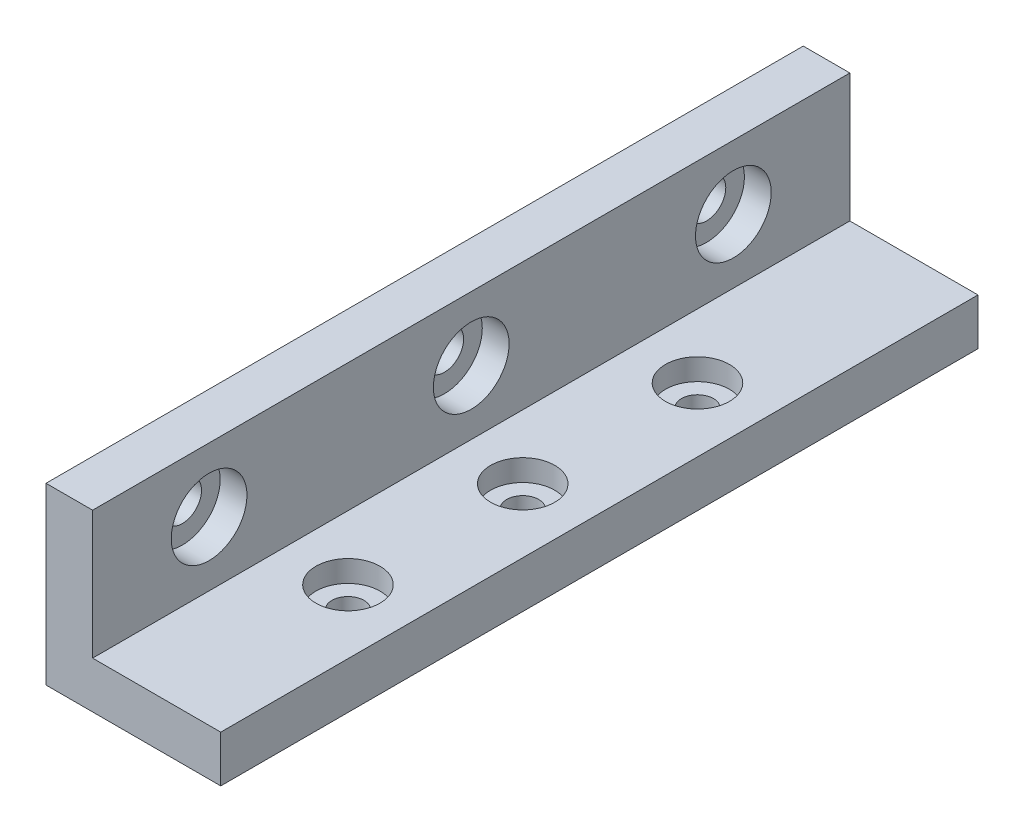
ISO-10303-21;
HEADER;
FILE_DESCRIPTION(('STEP AP214'),'2;1');
FILE_NAME('part.step','',(''),(''),'','','');
FILE_SCHEMA(('AUTOMOTIVE_DESIGN { 1 0 10303 214 1 1 1 1 }'));
ENDSEC;
DATA;
#1=APPLICATION_CONTEXT('core data for automotive mechanical design processes');
#2=APPLICATION_PROTOCOL_DEFINITION('international standard','automotive_design',2000,#1);
#3=PRODUCT_CONTEXT('',#1,'mechanical');
#4=PRODUCT('Part','Part','',(#3));
#5=PRODUCT_RELATED_PRODUCT_CATEGORY('part','',(#4));
#6=PRODUCT_DEFINITION_FORMATION('','',#4);
#7=PRODUCT_DEFINITION_CONTEXT('part definition',#1,'design');
#8=PRODUCT_DEFINITION('design','',#6,#7);
#9=PRODUCT_DEFINITION_SHAPE('','',#8);
#10=(LENGTH_UNIT() NAMED_UNIT(*) SI_UNIT(.MILLI.,.METRE.));
#11=(NAMED_UNIT(*) PLANE_ANGLE_UNIT() SI_UNIT($,.RADIAN.));
#12=(NAMED_UNIT(*) SI_UNIT($,.STERADIAN.) SOLID_ANGLE_UNIT());
#13=UNCERTAINTY_MEASURE_WITH_UNIT(LENGTH_MEASURE(1.E-05),#10,'distance_accuracy_value','');
#14=(GEOMETRIC_REPRESENTATION_CONTEXT(3) GLOBAL_UNCERTAINTY_ASSIGNED_CONTEXT((#13)) GLOBAL_UNIT_ASSIGNED_CONTEXT((#10,
#11,#12)) REPRESENTATION_CONTEXT('',''));
#15=CARTESIAN_POINT('',(0.,0.,0.));
#16=DIRECTION('',(0.,0.,1.));
#17=DIRECTION('',(1.,0.,0.));
#18=AXIS2_PLACEMENT_3D('',#15,#16,#17);
#19=CARTESIAN_POINT('',(0.,0.,130.));
#20=DIRECTION('',(0.,1.,0.));
#21=DIRECTION('',(0.,0.,1.));
#22=AXIS2_PLACEMENT_3D('',#19,#20,#21);
#23=PLANE('',#22);
#24=CARTESIAN_POINT('',(19.,0.,67.1605336776415));
#25=DIRECTION('',(0.,1.,0.));
#26=DIRECTION('',(0.,0.,1.));
#27=AXIS2_PLACEMENT_3D('',#24,#25,#26);
#28=CIRCLE('',#27,2.75);
#29=CARTESIAN_POINT('',(19.,0.,69.9105336776415));
#30=VERTEX_POINT('',#29);
#31=EDGE_CURVE('E182',#30,#30,#28,.T.);
#32=ORIENTED_EDGE('',*,*,#31,.T.);
#33=EDGE_LOOP('',(#32));
#34=FACE_BOUND('',#33,.T.);
#35=CARTESIAN_POINT('',(19.,0.,37.1605336776415));
#36=DIRECTION('',(0.,1.,0.));
#37=DIRECTION('',(0.,0.,1.));
#38=AXIS2_PLACEMENT_3D('',#35,#36,#37);
#39=CIRCLE('',#38,2.75);
#40=CARTESIAN_POINT('',(19.,0.,39.9105336776415));
#41=VERTEX_POINT('',#40);
#42=EDGE_CURVE('E186',#41,#41,#39,.T.);
#43=ORIENTED_EDGE('',*,*,#42,.T.);
#44=EDGE_LOOP('',(#43));
#45=FACE_BOUND('',#44,.T.);
#46=CARTESIAN_POINT('',(19.,0.,97.1605336776415));
#47=DIRECTION('',(0.,1.,0.));
#48=DIRECTION('',(0.,0.,1.));
#49=AXIS2_PLACEMENT_3D('',#46,#47,#48);
#50=CIRCLE('',#49,2.75);
#51=CARTESIAN_POINT('',(19.,0.,99.9105336776415));
#52=VERTEX_POINT('',#51);
#53=EDGE_CURVE('E135',#52,#52,#50,.T.);
#54=ORIENTED_EDGE('',*,*,#53,.T.);
#55=EDGE_LOOP('',(#54));
#56=FACE_BOUND('',#55,.T.);
#57=DIRECTION('',(1.,0.,0.));
#58=VECTOR('',#57,1.);
#59=CARTESIAN_POINT('',(0.,0.,0.));
#60=LINE('',#59,#58);
#61=CARTESIAN_POINT('',(0.,0.,0.));
#62=VERTEX_POINT('',#61);
#63=CARTESIAN_POINT('',(30.,0.,0.));
#64=VERTEX_POINT('',#63);
#65=EDGE_CURVE('E132',#62,#64,#60,.T.);
#66=ORIENTED_EDGE('',*,*,#65,.T.);
#67=DIRECTION('',(0.,0.,-1.));
#68=VECTOR('',#67,1.);
#69=CARTESIAN_POINT('',(30.,0.,130.));
#70=LINE('',#69,#68);
#71=CARTESIAN_POINT('',(30.,0.,130.));
#72=VERTEX_POINT('',#71);
#73=EDGE_CURVE('E13',#72,#64,#70,.T.);
#74=ORIENTED_EDGE('',*,*,#73,.F.);
#75=DIRECTION('',(1.,0.,0.));
#76=VECTOR('',#75,1.);
#77=CARTESIAN_POINT('',(0.,0.,130.));
#78=LINE('',#77,#76);
#79=CARTESIAN_POINT('',(0.,0.,130.));
#80=VERTEX_POINT('',#79);
#81=EDGE_CURVE('E147',#80,#72,#78,.T.);
#82=ORIENTED_EDGE('',*,*,#81,.F.);
#83=DIRECTION('',(0.,0.,-1.));
#84=VECTOR('',#83,1.);
#85=CARTESIAN_POINT('',(0.,0.,130.));
#86=LINE('',#85,#84);
#87=EDGE_CURVE('E64',#80,#62,#86,.T.);
#88=ORIENTED_EDGE('',*,*,#87,.T.);
#89=EDGE_LOOP('',(#66,#74,#82,#88));
#90=FACE_BOUND('',#89,.T.);
#91=ADVANCED_FACE('F48',(#34,#45,#56,#90),#23,.F.);
#92=CARTESIAN_POINT('',(30.,0.,130.));
#93=DIRECTION('',(-1.,0.,0.));
#94=DIRECTION('',(0.,0.,1.));
#95=AXIS2_PLACEMENT_3D('',#92,#93,#94);
#96=PLANE('',#95);
#97=DIRECTION('',(0.,1.,0.));
#98=VECTOR('',#97,1.);
#99=CARTESIAN_POINT('',(30.,0.,0.));
#100=LINE('',#99,#98);
#101=CARTESIAN_POINT('',(30.,8.,0.));
#102=VERTEX_POINT('',#101);
#103=EDGE_CURVE('E134',#64,#102,#100,.T.);
#104=ORIENTED_EDGE('',*,*,#103,.T.);
#105=DIRECTION('',(0.,0.,-1.));
#106=VECTOR('',#105,1.);
#107=CARTESIAN_POINT('',(30.,8.,130.));
#108=LINE('',#107,#106);
#109=CARTESIAN_POINT('',(30.,8.,130.));
#110=VERTEX_POINT('',#109);
#111=EDGE_CURVE('E56',#110,#102,#108,.T.);
#112=ORIENTED_EDGE('',*,*,#111,.F.);
#113=DIRECTION('',(0.,1.,0.));
#114=VECTOR('',#113,1.);
#115=CARTESIAN_POINT('',(30.,0.,130.));
#116=LINE('',#115,#114);
#117=EDGE_CURVE('E96',#72,#110,#116,.T.);
#118=ORIENTED_EDGE('',*,*,#117,.F.);
#119=ORIENTED_EDGE('',*,*,#73,.T.);
#120=EDGE_LOOP('',(#104,#112,#118,#119));
#121=FACE_BOUND('',#120,.T.);
#122=ADVANCED_FACE('F153',(#121),#96,.F.);
#123=CARTESIAN_POINT('',(0.,8.,130.));
#124=DIRECTION('',(0.,1.,0.));
#125=DIRECTION('',(0.,0.,1.));
#126=AXIS2_PLACEMENT_3D('',#123,#124,#125);
#127=PLANE('',#126);
#128=CARTESIAN_POINT('',(19.,8.,67.1605336776415));
#129=DIRECTION('',(0.,1.,0.));
#130=DIRECTION('',(0.,0.,1.));
#131=AXIS2_PLACEMENT_3D('',#128,#129,#130);
#132=CIRCLE('',#131,5.5);
#133=CARTESIAN_POINT('',(19.,8.,72.6605336776415));
#134=VERTEX_POINT('',#133);
#135=EDGE_CURVE('E219',#134,#134,#132,.T.);
#136=ORIENTED_EDGE('',*,*,#135,.F.);
#137=EDGE_LOOP('',(#136));
#138=FACE_BOUND('',#137,.T.);
#139=CARTESIAN_POINT('',(19.,8.,37.1605336776415));
#140=DIRECTION('',(0.,1.,0.));
#141=DIRECTION('',(0.,0.,1.));
#142=AXIS2_PLACEMENT_3D('',#139,#140,#141);
#143=CIRCLE('',#142,5.5);
#144=CARTESIAN_POINT('',(19.,8.,42.6605336776415));
#145=VERTEX_POINT('',#144);
#146=EDGE_CURVE('E209',#145,#145,#143,.T.);
#147=ORIENTED_EDGE('',*,*,#146,.F.);
#148=EDGE_LOOP('',(#147));
#149=FACE_BOUND('',#148,.T.);
#150=CARTESIAN_POINT('',(19.,8.,97.1605336776415));
#151=DIRECTION('',(0.,1.,0.));
#152=DIRECTION('',(0.,0.,1.));
#153=AXIS2_PLACEMENT_3D('',#150,#151,#152);
#154=CIRCLE('',#153,5.5);
#155=CARTESIAN_POINT('',(19.,8.,102.660533677641));
#156=VERTEX_POINT('',#155);
#157=EDGE_CURVE('E199',#156,#156,#154,.T.);
#158=ORIENTED_EDGE('',*,*,#157,.F.);
#159=EDGE_LOOP('',(#158));
#160=FACE_BOUND('',#159,.T.);
#161=DIRECTION('',(1.,0.,0.));
#162=VECTOR('',#161,1.);
#163=CARTESIAN_POINT('',(0.,8.,0.));
#164=LINE('',#163,#162);
#165=CARTESIAN_POINT('',(8.,8.,0.));
#166=VERTEX_POINT('',#165);
#167=EDGE_CURVE('E138',#166,#102,#164,.T.);
#168=ORIENTED_EDGE('',*,*,#167,.F.);
#169=DIRECTION('',(0.,0.,-1.));
#170=VECTOR('',#169,1.);
#171=CARTESIAN_POINT('',(8.,8.,130.));
#172=LINE('',#171,#170);
#173=CARTESIAN_POINT('',(8.,8.,130.));
#174=VERTEX_POINT('',#173);
#175=EDGE_CURVE('E124',#174,#166,#172,.T.);
#176=ORIENTED_EDGE('',*,*,#175,.F.);
#177=DIRECTION('',(1.,0.,0.));
#178=VECTOR('',#177,1.);
#179=CARTESIAN_POINT('',(0.,8.,130.));
#180=LINE('',#179,#178);
#181=EDGE_CURVE('E114',#174,#110,#180,.T.);
#182=ORIENTED_EDGE('',*,*,#181,.T.);
#183=ORIENTED_EDGE('',*,*,#111,.T.);
#184=EDGE_LOOP('',(#168,#176,#182,#183));
#185=FACE_BOUND('',#184,.T.);
#186=ADVANCED_FACE('F152',(#138,#149,#160,#185),#127,.T.);
#187=CARTESIAN_POINT('',(8.,0.,130.));
#188=DIRECTION('',(-1.,0.,0.));
#189=DIRECTION('',(0.,-1.,0.));
#190=AXIS2_PLACEMENT_3D('',#187,#188,#189);
#191=PLANE('',#190);
#192=CARTESIAN_POINT('',(8.,19.,110.));
#193=DIRECTION('',(1.,0.,0.));
#194=DIRECTION('',(0.,0.,-1.));
#195=AXIS2_PLACEMENT_3D('',#192,#193,#194);
#196=CIRCLE('',#195,6.5);
#197=CARTESIAN_POINT('',(8.,19.,103.5));
#198=VERTEX_POINT('',#197);
#199=EDGE_CURVE('E254',#198,#198,#196,.T.);
#200=ORIENTED_EDGE('',*,*,#199,.F.);
#201=EDGE_LOOP('',(#200));
#202=FACE_BOUND('',#201,.T.);
#203=CARTESIAN_POINT('',(8.,19.,65.));
#204=DIRECTION('',(1.,0.,0.));
#205=DIRECTION('',(0.,0.,-1.));
#206=AXIS2_PLACEMENT_3D('',#203,#204,#205);
#207=CIRCLE('',#206,6.5);
#208=CARTESIAN_POINT('',(8.,19.,58.5));
#209=VERTEX_POINT('',#208);
#210=EDGE_CURVE('E243',#209,#209,#207,.T.);
#211=ORIENTED_EDGE('',*,*,#210,.F.);
#212=EDGE_LOOP('',(#211));
#213=FACE_BOUND('',#212,.T.);
#214=CARTESIAN_POINT('',(8.,19.,20.));
#215=DIRECTION('',(1.,0.,0.));
#216=DIRECTION('',(0.,0.,-1.));
#217=AXIS2_PLACEMENT_3D('',#214,#215,#216);
#218=CIRCLE('',#217,6.5);
#219=CARTESIAN_POINT('',(8.,19.,13.5));
#220=VERTEX_POINT('',#219);
#221=EDGE_CURVE('E231',#220,#220,#218,.T.);
#222=ORIENTED_EDGE('',*,*,#221,.F.);
#223=EDGE_LOOP('',(#222));
#224=FACE_BOUND('',#223,.T.);
#225=DIRECTION('',(0.,1.,0.));
#226=VECTOR('',#225,1.);
#227=CARTESIAN_POINT('',(8.,0.,0.));
#228=LINE('',#227,#226);
#229=CARTESIAN_POINT('',(8.,30.,0.));
#230=VERTEX_POINT('',#229);
#231=EDGE_CURVE('E121',#166,#230,#228,.T.);
#232=ORIENTED_EDGE('',*,*,#231,.T.);
#233=DIRECTION('',(0.,0.,-1.));
#234=VECTOR('',#233,1.);
#235=CARTESIAN_POINT('',(8.,30.,130.));
#236=LINE('',#235,#234);
#237=CARTESIAN_POINT('',(8.,30.,130.));
#238=VERTEX_POINT('',#237);
#239=EDGE_CURVE('E118',#238,#230,#236,.T.);
#240=ORIENTED_EDGE('',*,*,#239,.F.);
#241=DIRECTION('',(0.,1.,0.));
#242=VECTOR('',#241,1.);
#243=CARTESIAN_POINT('',(8.,0.,130.));
#244=LINE('',#243,#242);
#245=EDGE_CURVE('E107',#174,#238,#244,.T.);
#246=ORIENTED_EDGE('',*,*,#245,.F.);
#247=ORIENTED_EDGE('',*,*,#175,.T.);
#248=EDGE_LOOP('',(#232,#240,#246,#247));
#249=FACE_BOUND('',#248,.T.);
#250=ADVANCED_FACE('F119',(#202,#213,#224,#249),#191,.F.);
#251=CARTESIAN_POINT('',(0.,30.,130.));
#252=DIRECTION('',(0.,1.,0.));
#253=DIRECTION('',(0.,0.,1.));
#254=AXIS2_PLACEMENT_3D('',#251,#252,#253);
#255=PLANE('',#254);
#256=DIRECTION('',(1.,0.,0.));
#257=VECTOR('',#256,1.);
#258=CARTESIAN_POINT('',(0.,30.,0.));
#259=LINE('',#258,#257);
#260=CARTESIAN_POINT('',(0.,30.,0.));
#261=VERTEX_POINT('',#260);
#262=EDGE_CURVE('E142',#261,#230,#259,.T.);
#263=ORIENTED_EDGE('',*,*,#262,.F.);
#264=DIRECTION('',(0.,0.,-1.));
#265=VECTOR('',#264,1.);
#266=CARTESIAN_POINT('',(0.,30.,130.));
#267=LINE('',#266,#265);
#268=CARTESIAN_POINT('',(0.,30.,130.));
#269=VERTEX_POINT('',#268);
#270=EDGE_CURVE('E84',#269,#261,#267,.T.);
#271=ORIENTED_EDGE('',*,*,#270,.F.);
#272=DIRECTION('',(1.,0.,0.));
#273=VECTOR('',#272,1.);
#274=CARTESIAN_POINT('',(0.,30.,130.));
#275=LINE('',#274,#273);
#276=EDGE_CURVE('E112',#269,#238,#275,.T.);
#277=ORIENTED_EDGE('',*,*,#276,.T.);
#278=ORIENTED_EDGE('',*,*,#239,.T.);
#279=EDGE_LOOP('',(#263,#271,#277,#278));
#280=FACE_BOUND('',#279,.T.);
#281=ADVANCED_FACE('F126',(#280),#255,.T.);
#282=CARTESIAN_POINT('',(0.,0.,130.));
#283=DIRECTION('',(-1.,0.,0.));
#284=DIRECTION('',(0.,0.,1.));
#285=AXIS2_PLACEMENT_3D('',#282,#283,#284);
#286=PLANE('',#285);
#287=CARTESIAN_POINT('',(0.,19.,110.));
#288=DIRECTION('',(1.,0.,0.));
#289=DIRECTION('',(0.,0.,-1.));
#290=AXIS2_PLACEMENT_3D('',#287,#288,#289);
#291=CIRCLE('',#290,3.3);
#292=CARTESIAN_POINT('',(0.,19.,106.7));
#293=VERTEX_POINT('',#292);
#294=EDGE_CURVE('E246',#293,#293,#291,.T.);
#295=ORIENTED_EDGE('',*,*,#294,.T.);
#296=EDGE_LOOP('',(#295));
#297=FACE_BOUND('',#296,.T.);
#298=CARTESIAN_POINT('',(0.,19.,65.));
#299=DIRECTION('',(1.,0.,0.));
#300=DIRECTION('',(0.,0.,-1.));
#301=AXIS2_PLACEMENT_3D('',#298,#299,#300);
#302=CIRCLE('',#301,3.3);
#303=CARTESIAN_POINT('',(0.,19.,61.7));
#304=VERTEX_POINT('',#303);
#305=EDGE_CURVE('E234',#304,#304,#302,.T.);
#306=ORIENTED_EDGE('',*,*,#305,.T.);
#307=EDGE_LOOP('',(#306));
#308=FACE_BOUND('',#307,.T.);
#309=CARTESIAN_POINT('',(0.,19.,20.));
#310=DIRECTION('',(1.,0.,0.));
#311=DIRECTION('',(0.,0.,-1.));
#312=AXIS2_PLACEMENT_3D('',#309,#310,#311);
#313=CIRCLE('',#312,3.3);
#314=CARTESIAN_POINT('',(0.,19.,16.7));
#315=VERTEX_POINT('',#314);
#316=EDGE_CURVE('E222',#315,#315,#313,.T.);
#317=ORIENTED_EDGE('',*,*,#316,.T.);
#318=EDGE_LOOP('',(#317));
#319=FACE_BOUND('',#318,.T.);
#320=DIRECTION('',(0.,1.,0.));
#321=VECTOR('',#320,1.);
#322=CARTESIAN_POINT('',(0.,0.,0.));
#323=LINE('',#322,#321);
#324=EDGE_CURVE('E144',#62,#261,#323,.T.);
#325=ORIENTED_EDGE('',*,*,#324,.F.);
#326=ORIENTED_EDGE('',*,*,#87,.F.);
#327=DIRECTION('',(0.,1.,0.));
#328=VECTOR('',#327,1.);
#329=CARTESIAN_POINT('',(0.,0.,130.));
#330=LINE('',#329,#328);
#331=EDGE_CURVE('E127',#80,#269,#330,.T.);
#332=ORIENTED_EDGE('',*,*,#331,.T.);
#333=ORIENTED_EDGE('',*,*,#270,.T.);
#334=EDGE_LOOP('',(#325,#326,#332,#333));
#335=FACE_BOUND('',#334,.T.);
#336=ADVANCED_FACE('F157',(#297,#308,#319,#335),#286,.T.);
#337=CARTESIAN_POINT('',(0.,0.,130.));
#338=DIRECTION('',(0.,0.,1.));
#339=DIRECTION('',(1.,0.,0.));
#340=AXIS2_PLACEMENT_3D('',#337,#338,#339);
#341=PLANE('',#340);
#342=ORIENTED_EDGE('',*,*,#81,.T.);
#343=ORIENTED_EDGE('',*,*,#117,.T.);
#344=ORIENTED_EDGE('',*,*,#181,.F.);
#345=ORIENTED_EDGE('',*,*,#245,.T.);
#346=ORIENTED_EDGE('',*,*,#276,.F.);
#347=ORIENTED_EDGE('',*,*,#331,.F.);
#348=EDGE_LOOP('',(#342,#343,#344,#345,#346,#347));
#349=FACE_BOUND('',#348,.T.);
#350=ADVANCED_FACE('F109',(#349),#341,.T.);
#351=CARTESIAN_POINT('',(0.,0.,0.));
#352=DIRECTION('',(0.,0.,1.));
#353=DIRECTION('',(1.,0.,0.));
#354=AXIS2_PLACEMENT_3D('',#351,#352,#353);
#355=PLANE('',#354);
#356=ORIENTED_EDGE('',*,*,#65,.F.);
#357=ORIENTED_EDGE('',*,*,#324,.T.);
#358=ORIENTED_EDGE('',*,*,#262,.T.);
#359=ORIENTED_EDGE('',*,*,#231,.F.);
#360=ORIENTED_EDGE('',*,*,#167,.T.);
#361=ORIENTED_EDGE('',*,*,#103,.F.);
#362=EDGE_LOOP('',(#356,#357,#358,#359,#360,#361));
#363=FACE_BOUND('',#362,.T.);
#364=ADVANCED_FACE('F156',(#363),#355,.F.);
#365=CARTESIAN_POINT('',(19.,8.,97.1605336776415));
#366=DIRECTION('',(0.,1.,0.));
#367=DIRECTION('',(0.,0.,1.));
#368=AXIS2_PLACEMENT_3D('',#365,#366,#367);
#369=CYLINDRICAL_SURFACE('',#368,2.75);
#370=ORIENTED_EDGE('',*,*,#53,.F.);
#371=EDGE_LOOP('',(#370));
#372=FACE_BOUND('',#371,.T.);
#373=CARTESIAN_POINT('',(19.,4.3,97.1605336776415));
#374=DIRECTION('',(0.,1.,0.));
#375=DIRECTION('',(0.,0.,1.));
#376=AXIS2_PLACEMENT_3D('',#373,#374,#375);
#377=CIRCLE('',#376,2.75);
#378=CARTESIAN_POINT('',(19.,4.3,99.9105336776415));
#379=VERTEX_POINT('',#378);
#380=EDGE_CURVE('E193',#379,#379,#377,.T.);
#381=ORIENTED_EDGE('',*,*,#380,.T.);
#382=EDGE_LOOP('',(#381));
#383=FACE_BOUND('',#382,.T.);
#384=ADVANCED_FACE('F319',(#372,#383),#369,.F.);
#385=CARTESIAN_POINT('',(21.75,4.3,97.1605336776415));
#386=DIRECTION('',(0.,-1.,0.));
#387=DIRECTION('',(0.,0.,-1.));
#388=AXIS2_PLACEMENT_3D('',#385,#386,#387);
#389=PLANE('',#388);
#390=ORIENTED_EDGE('',*,*,#380,.F.);
#391=EDGE_LOOP('',(#390));
#392=FACE_BOUND('',#391,.T.);
#393=CARTESIAN_POINT('',(19.,4.3,97.1605336776415));
#394=DIRECTION('',(0.,1.,0.));
#395=DIRECTION('',(0.,0.,1.));
#396=AXIS2_PLACEMENT_3D('',#393,#394,#395);
#397=CIRCLE('',#396,5.5);
#398=CARTESIAN_POINT('',(19.,4.3,102.660533677641));
#399=VERTEX_POINT('',#398);
#400=EDGE_CURVE('E196',#399,#399,#397,.T.);
#401=ORIENTED_EDGE('',*,*,#400,.T.);
#402=EDGE_LOOP('',(#401));
#403=FACE_BOUND('',#402,.T.);
#404=ADVANCED_FACE('F315',(#392,#403),#389,.F.);
#405=CARTESIAN_POINT('',(19.,8.,97.1605336776415));
#406=DIRECTION('',(0.,1.,0.));
#407=DIRECTION('',(0.,0.,1.));
#408=AXIS2_PLACEMENT_3D('',#405,#406,#407);
#409=CYLINDRICAL_SURFACE('',#408,5.5);
#410=ORIENTED_EDGE('',*,*,#400,.F.);
#411=EDGE_LOOP('',(#410));
#412=FACE_BOUND('',#411,.T.);
#413=ORIENTED_EDGE('',*,*,#157,.T.);
#414=EDGE_LOOP('',(#413));
#415=FACE_BOUND('',#414,.T.);
#416=ADVANCED_FACE('F311',(#412,#415),#409,.F.);
#417=CARTESIAN_POINT('',(19.,8.,37.1605336776415));
#418=DIRECTION('',(0.,1.,0.));
#419=DIRECTION('',(0.,0.,1.));
#420=AXIS2_PLACEMENT_3D('',#417,#418,#419);
#421=CYLINDRICAL_SURFACE('',#420,2.75);
#422=ORIENTED_EDGE('',*,*,#42,.F.);
#423=EDGE_LOOP('',(#422));
#424=FACE_BOUND('',#423,.T.);
#425=CARTESIAN_POINT('',(19.,4.3,37.1605336776415));
#426=DIRECTION('',(0.,1.,0.));
#427=DIRECTION('',(0.,0.,1.));
#428=AXIS2_PLACEMENT_3D('',#425,#426,#427);
#429=CIRCLE('',#428,2.75);
#430=CARTESIAN_POINT('',(19.,4.3,39.9105336776415));
#431=VERTEX_POINT('',#430);
#432=EDGE_CURVE('E203',#431,#431,#429,.T.);
#433=ORIENTED_EDGE('',*,*,#432,.T.);
#434=EDGE_LOOP('',(#433));
#435=FACE_BOUND('',#434,.T.);
#436=ADVANCED_FACE('F307',(#424,#435),#421,.F.);
#437=CARTESIAN_POINT('',(21.75,4.3,37.1605336776415));
#438=DIRECTION('',(0.,-1.,0.));
#439=DIRECTION('',(0.,0.,-1.));
#440=AXIS2_PLACEMENT_3D('',#437,#438,#439);
#441=PLANE('',#440);
#442=ORIENTED_EDGE('',*,*,#432,.F.);
#443=EDGE_LOOP('',(#442));
#444=FACE_BOUND('',#443,.T.);
#445=CARTESIAN_POINT('',(19.,4.3,37.1605336776415));
#446=DIRECTION('',(0.,1.,0.));
#447=DIRECTION('',(0.,0.,1.));
#448=AXIS2_PLACEMENT_3D('',#445,#446,#447);
#449=CIRCLE('',#448,5.5);
#450=CARTESIAN_POINT('',(19.,4.3,42.6605336776415));
#451=VERTEX_POINT('',#450);
#452=EDGE_CURVE('E206',#451,#451,#449,.T.);
#453=ORIENTED_EDGE('',*,*,#452,.T.);
#454=EDGE_LOOP('',(#453));
#455=FACE_BOUND('',#454,.T.);
#456=ADVANCED_FACE('F303',(#444,#455),#441,.F.);
#457=CARTESIAN_POINT('',(19.,8.,37.1605336776415));
#458=DIRECTION('',(0.,1.,0.));
#459=DIRECTION('',(0.,0.,1.));
#460=AXIS2_PLACEMENT_3D('',#457,#458,#459);
#461=CYLINDRICAL_SURFACE('',#460,5.5);
#462=ORIENTED_EDGE('',*,*,#452,.F.);
#463=EDGE_LOOP('',(#462));
#464=FACE_BOUND('',#463,.T.);
#465=ORIENTED_EDGE('',*,*,#146,.T.);
#466=EDGE_LOOP('',(#465));
#467=FACE_BOUND('',#466,.T.);
#468=ADVANCED_FACE('F299',(#464,#467),#461,.F.);
#469=CARTESIAN_POINT('',(19.,8.,67.1605336776415));
#470=DIRECTION('',(0.,1.,0.));
#471=DIRECTION('',(0.,0.,1.));
#472=AXIS2_PLACEMENT_3D('',#469,#470,#471);
#473=CYLINDRICAL_SURFACE('',#472,2.75);
#474=ORIENTED_EDGE('',*,*,#31,.F.);
#475=EDGE_LOOP('',(#474));
#476=FACE_BOUND('',#475,.T.);
#477=CARTESIAN_POINT('',(19.,4.3,67.1605336776415));
#478=DIRECTION('',(0.,1.,0.));
#479=DIRECTION('',(0.,0.,1.));
#480=AXIS2_PLACEMENT_3D('',#477,#478,#479);
#481=CIRCLE('',#480,2.75);
#482=CARTESIAN_POINT('',(19.,4.3,69.9105336776415));
#483=VERTEX_POINT('',#482);
#484=EDGE_CURVE('E213',#483,#483,#481,.T.);
#485=ORIENTED_EDGE('',*,*,#484,.T.);
#486=EDGE_LOOP('',(#485));
#487=FACE_BOUND('',#486,.T.);
#488=ADVANCED_FACE('F295',(#476,#487),#473,.F.);
#489=CARTESIAN_POINT('',(21.75,4.3,67.1605336776415));
#490=DIRECTION('',(0.,-1.,0.));
#491=DIRECTION('',(0.,0.,-1.));
#492=AXIS2_PLACEMENT_3D('',#489,#490,#491);
#493=PLANE('',#492);
#494=ORIENTED_EDGE('',*,*,#484,.F.);
#495=EDGE_LOOP('',(#494));
#496=FACE_BOUND('',#495,.T.);
#497=CARTESIAN_POINT('',(19.,4.3,67.1605336776415));
#498=DIRECTION('',(0.,1.,0.));
#499=DIRECTION('',(0.,0.,1.));
#500=AXIS2_PLACEMENT_3D('',#497,#498,#499);
#501=CIRCLE('',#500,5.5);
#502=CARTESIAN_POINT('',(19.,4.3,72.6605336776415));
#503=VERTEX_POINT('',#502);
#504=EDGE_CURVE('E216',#503,#503,#501,.T.);
#505=ORIENTED_EDGE('',*,*,#504,.T.);
#506=EDGE_LOOP('',(#505));
#507=FACE_BOUND('',#506,.T.);
#508=ADVANCED_FACE('F291',(#496,#507),#493,.F.);
#509=CARTESIAN_POINT('',(19.,8.,67.1605336776415));
#510=DIRECTION('',(0.,1.,0.));
#511=DIRECTION('',(0.,0.,1.));
#512=AXIS2_PLACEMENT_3D('',#509,#510,#511);
#513=CYLINDRICAL_SURFACE('',#512,5.5);
#514=ORIENTED_EDGE('',*,*,#504,.F.);
#515=EDGE_LOOP('',(#514));
#516=FACE_BOUND('',#515,.T.);
#517=ORIENTED_EDGE('',*,*,#135,.T.);
#518=EDGE_LOOP('',(#517));
#519=FACE_BOUND('',#518,.T.);
#520=ADVANCED_FACE('F287',(#516,#519),#513,.F.);
#521=CARTESIAN_POINT('',(8.,19.,20.));
#522=DIRECTION('',(1.,0.,0.));
#523=DIRECTION('',(0.,0.,-1.));
#524=AXIS2_PLACEMENT_3D('',#521,#522,#523);
#525=CYLINDRICAL_SURFACE('',#524,3.3);
#526=ORIENTED_EDGE('',*,*,#316,.F.);
#527=EDGE_LOOP('',(#526));
#528=FACE_BOUND('',#527,.T.);
#529=CARTESIAN_POINT('',(3.4,19.,20.));
#530=DIRECTION('',(1.,0.,0.));
#531=DIRECTION('',(0.,0.,-1.));
#532=AXIS2_PLACEMENT_3D('',#529,#530,#531);
#533=CIRCLE('',#532,3.3);
#534=CARTESIAN_POINT('',(3.4,19.,16.7));
#535=VERTEX_POINT('',#534);
#536=EDGE_CURVE('E225',#535,#535,#533,.T.);
#537=ORIENTED_EDGE('',*,*,#536,.T.);
#538=EDGE_LOOP('',(#537));
#539=FACE_BOUND('',#538,.T.);
#540=ADVANCED_FACE('F279',(#528,#539),#525,.F.);
#541=CARTESIAN_POINT('',(3.4,22.3,20.));
#542=DIRECTION('',(-1.,0.,0.));
#543=DIRECTION('',(0.,0.,1.));
#544=AXIS2_PLACEMENT_3D('',#541,#542,#543);
#545=PLANE('',#544);
#546=ORIENTED_EDGE('',*,*,#536,.F.);
#547=EDGE_LOOP('',(#546));
#548=FACE_BOUND('',#547,.T.);
#549=CARTESIAN_POINT('',(3.4,19.,20.));
#550=DIRECTION('',(1.,0.,0.));
#551=DIRECTION('',(0.,0.,-1.));
#552=AXIS2_PLACEMENT_3D('',#549,#550,#551);
#553=CIRCLE('',#552,6.5);
#554=CARTESIAN_POINT('',(3.4,19.,13.5));
#555=VERTEX_POINT('',#554);
#556=EDGE_CURVE('E228',#555,#555,#553,.T.);
#557=ORIENTED_EDGE('',*,*,#556,.T.);
#558=EDGE_LOOP('',(#557));
#559=FACE_BOUND('',#558,.T.);
#560=ADVANCED_FACE('F269',(#548,#559),#545,.F.);
#561=CARTESIAN_POINT('',(8.,19.,20.));
#562=DIRECTION('',(1.,0.,0.));
#563=DIRECTION('',(0.,0.,-1.));
#564=AXIS2_PLACEMENT_3D('',#561,#562,#563);
#565=CYLINDRICAL_SURFACE('',#564,6.5);
#566=ORIENTED_EDGE('',*,*,#556,.F.);
#567=EDGE_LOOP('',(#566));
#568=FACE_BOUND('',#567,.T.);
#569=ORIENTED_EDGE('',*,*,#221,.T.);
#570=EDGE_LOOP('',(#569));
#571=FACE_BOUND('',#570,.T.);
#572=ADVANCED_FACE('F266',(#568,#571),#565,.F.);
#573=CARTESIAN_POINT('',(8.,19.,65.));
#574=DIRECTION('',(1.,0.,0.));
#575=DIRECTION('',(0.,0.,-1.));
#576=AXIS2_PLACEMENT_3D('',#573,#574,#575);
#577=CYLINDRICAL_SURFACE('',#576,3.3);
#578=ORIENTED_EDGE('',*,*,#305,.F.);
#579=EDGE_LOOP('',(#578));
#580=FACE_BOUND('',#579,.T.);
#581=CARTESIAN_POINT('',(3.4,19.,65.));
#582=DIRECTION('',(1.,0.,0.));
#583=DIRECTION('',(0.,0.,-1.));
#584=AXIS2_PLACEMENT_3D('',#581,#582,#583);
#585=CIRCLE('',#584,3.3);
#586=CARTESIAN_POINT('',(3.4,19.,61.7));
#587=VERTEX_POINT('',#586);
#588=EDGE_CURVE('E237',#587,#587,#585,.T.);
#589=ORIENTED_EDGE('',*,*,#588,.T.);
#590=EDGE_LOOP('',(#589));
#591=FACE_BOUND('',#590,.T.);
#592=ADVANCED_FACE('F268',(#580,#591),#577,.F.);
#593=CARTESIAN_POINT('',(3.4,22.3,65.));
#594=DIRECTION('',(-1.,0.,0.));
#595=DIRECTION('',(0.,0.,1.));
#596=AXIS2_PLACEMENT_3D('',#593,#594,#595);
#597=PLANE('',#596);
#598=ORIENTED_EDGE('',*,*,#588,.F.);
#599=EDGE_LOOP('',(#598));
#600=FACE_BOUND('',#599,.T.);
#601=CARTESIAN_POINT('',(3.4,19.,65.));
#602=DIRECTION('',(1.,0.,0.));
#603=DIRECTION('',(0.,0.,-1.));
#604=AXIS2_PLACEMENT_3D('',#601,#602,#603);
#605=CIRCLE('',#604,6.5);
#606=CARTESIAN_POINT('',(3.4,19.,58.5));
#607=VERTEX_POINT('',#606);
#608=EDGE_CURVE('E240',#607,#607,#605,.T.);
#609=ORIENTED_EDGE('',*,*,#608,.T.);
#610=EDGE_LOOP('',(#609));
#611=FACE_BOUND('',#610,.T.);
#612=ADVANCED_FACE('F276',(#600,#611),#597,.F.);
#613=CARTESIAN_POINT('',(8.,19.,65.));
#614=DIRECTION('',(1.,0.,0.));
#615=DIRECTION('',(0.,0.,-1.));
#616=AXIS2_PLACEMENT_3D('',#613,#614,#615);
#617=CYLINDRICAL_SURFACE('',#616,6.5);
#618=ORIENTED_EDGE('',*,*,#608,.F.);
#619=EDGE_LOOP('',(#618));
#620=FACE_BOUND('',#619,.T.);
#621=ORIENTED_EDGE('',*,*,#210,.T.);
#622=EDGE_LOOP('',(#621));
#623=FACE_BOUND('',#622,.T.);
#624=ADVANCED_FACE('F389',(#620,#623),#617,.F.);
#625=CARTESIAN_POINT('',(8.,19.,110.));
#626=DIRECTION('',(1.,0.,0.));
#627=DIRECTION('',(0.,0.,-1.));
#628=AXIS2_PLACEMENT_3D('',#625,#626,#627);
#629=CYLINDRICAL_SURFACE('',#628,3.3);
#630=ORIENTED_EDGE('',*,*,#294,.F.);
#631=EDGE_LOOP('',(#630));
#632=FACE_BOUND('',#631,.T.);
#633=CARTESIAN_POINT('',(3.4,19.,110.));
#634=DIRECTION('',(1.,0.,0.));
#635=DIRECTION('',(0.,0.,-1.));
#636=AXIS2_PLACEMENT_3D('',#633,#634,#635);
#637=CIRCLE('',#636,3.3);
#638=CARTESIAN_POINT('',(3.4,19.,106.7));
#639=VERTEX_POINT('',#638);
#640=EDGE_CURVE('E248',#639,#639,#637,.T.);
#641=ORIENTED_EDGE('',*,*,#640,.T.);
#642=EDGE_LOOP('',(#641));
#643=FACE_BOUND('',#642,.T.);
#644=ADVANCED_FACE('F398',(#632,#643),#629,.F.);
#645=CARTESIAN_POINT('',(3.4,22.3,110.));
#646=DIRECTION('',(-1.,0.,0.));
#647=DIRECTION('',(0.,0.,1.));
#648=AXIS2_PLACEMENT_3D('',#645,#646,#647);
#649=PLANE('',#648);
#650=ORIENTED_EDGE('',*,*,#640,.F.);
#651=EDGE_LOOP('',(#650));
#652=FACE_BOUND('',#651,.T.);
#653=CARTESIAN_POINT('',(3.4,19.,110.));
#654=DIRECTION('',(1.,0.,0.));
#655=DIRECTION('',(0.,0.,-1.));
#656=AXIS2_PLACEMENT_3D('',#653,#654,#655);
#657=CIRCLE('',#656,6.5);
#658=CARTESIAN_POINT('',(3.4,19.,103.5));
#659=VERTEX_POINT('',#658);
#660=EDGE_CURVE('E251',#659,#659,#657,.T.);
#661=ORIENTED_EDGE('',*,*,#660,.T.);
#662=EDGE_LOOP('',(#661));
#663=FACE_BOUND('',#662,.T.);
#664=ADVANCED_FACE('F408',(#652,#663),#649,.F.);
#665=CARTESIAN_POINT('',(8.,19.,110.));
#666=DIRECTION('',(1.,0.,0.));
#667=DIRECTION('',(0.,0.,-1.));
#668=AXIS2_PLACEMENT_3D('',#665,#666,#667);
#669=CYLINDRICAL_SURFACE('',#668,6.5);
#670=ORIENTED_EDGE('',*,*,#660,.F.);
#671=EDGE_LOOP('',(#670));
#672=FACE_BOUND('',#671,.T.);
#673=ORIENTED_EDGE('',*,*,#199,.T.);
#674=EDGE_LOOP('',(#673));
#675=FACE_BOUND('',#674,.T.);
#676=ADVANCED_FACE('F258',(#672,#675),#669,.F.);
#677=CLOSED_SHELL('',(#91,#122,#186,#250,#281,#336,#350,#364,#384,#404,#416,#436,#456,#468,#488,
#508,#520,#540,#560,#572,#592,#612,#624,#644,#664,#676));
#678=MANIFOLD_SOLID_BREP('B2',#677);
#679=ADVANCED_BREP_SHAPE_REPRESENTATION('',(#18,#678),#14);
#680=SHAPE_DEFINITION_REPRESENTATION(#9,#679);
ENDSEC;
END-ISO-10303-21;
